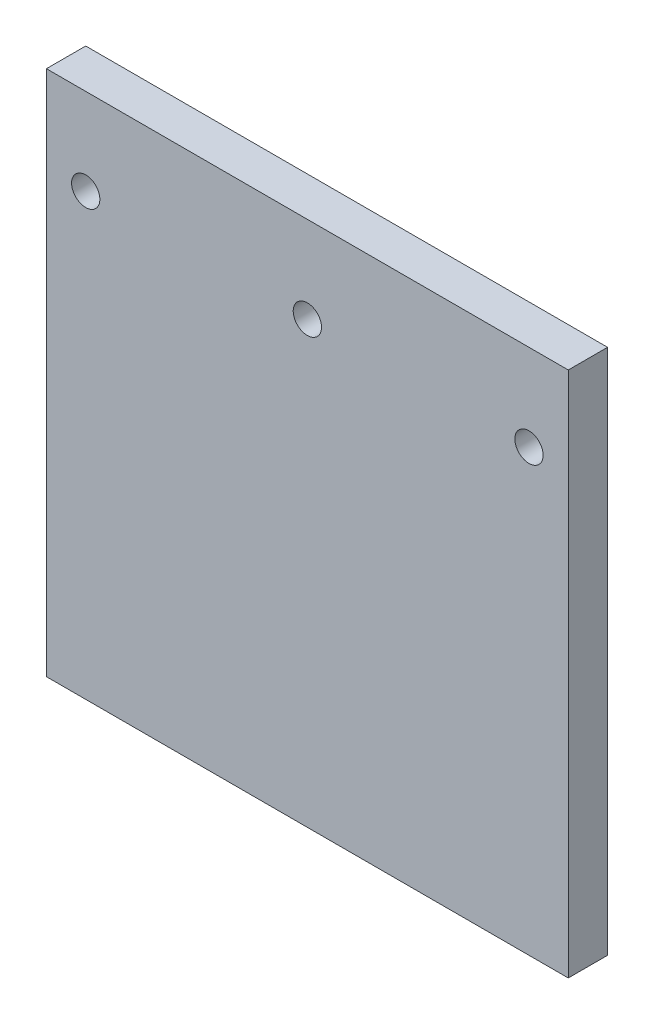
ISO-10303-21;
HEADER;
FILE_DESCRIPTION(('STEP AP214'),'2;1');
FILE_NAME('part.step','',(''),(''),'','','');
FILE_SCHEMA(('AUTOMOTIVE_DESIGN { 1 0 10303 214 1 1 1 1 }'));
ENDSEC;
DATA;
#1=APPLICATION_CONTEXT('core data for automotive mechanical design processes');
#2=APPLICATION_PROTOCOL_DEFINITION('international standard','automotive_design',2000,#1);
#3=PRODUCT_CONTEXT('',#1,'mechanical');
#4=PRODUCT('Part','Part','',(#3));
#5=PRODUCT_RELATED_PRODUCT_CATEGORY('part','',(#4));
#6=PRODUCT_DEFINITION_FORMATION('','',#4);
#7=PRODUCT_DEFINITION_CONTEXT('part definition',#1,'design');
#8=PRODUCT_DEFINITION('design','',#6,#7);
#9=PRODUCT_DEFINITION_SHAPE('','',#8);
#10=(LENGTH_UNIT() NAMED_UNIT(*) SI_UNIT(.MILLI.,.METRE.));
#11=(NAMED_UNIT(*) PLANE_ANGLE_UNIT() SI_UNIT($,.RADIAN.));
#12=(NAMED_UNIT(*) SI_UNIT($,.STERADIAN.) SOLID_ANGLE_UNIT());
#13=UNCERTAINTY_MEASURE_WITH_UNIT(LENGTH_MEASURE(1.E-05),#10,'distance_accuracy_value','');
#14=(GEOMETRIC_REPRESENTATION_CONTEXT(3) GLOBAL_UNCERTAINTY_ASSIGNED_CONTEXT((#13)) GLOBAL_UNIT_ASSIGNED_CONTEXT((#10,
#11,#12)) REPRESENTATION_CONTEXT('',''));
#15=CARTESIAN_POINT('',(0.,0.,0.));
#16=DIRECTION('',(0.,0.,1.));
#17=DIRECTION('',(1.,0.,0.));
#18=AXIS2_PLACEMENT_3D('',#15,#16,#17);
#19=CARTESIAN_POINT('',(0.,22.,0.));
#20=DIRECTION('',(0.,1.,0.));
#21=DIRECTION('',(0.,0.,1.));
#22=AXIS2_PLACEMENT_3D('',#19,#20,#21);
#23=PLANE('',#22);
#24=DIRECTION('',(0.,0.,1.));
#25=VECTOR('',#24,1.);
#26=CARTESIAN_POINT('',(58.2,22.,-114.));
#27=LINE('',#26,#25);
#28=CARTESIAN_POINT('',(58.2,22.,-27.));
#29=VERTEX_POINT('',#28);
#30=CARTESIAN_POINT('',(58.2,22.,-22.));
#31=VERTEX_POINT('',#30);
#32=EDGE_CURVE('E54',#29,#31,#27,.T.);
#33=ORIENTED_EDGE('',*,*,#32,.F.);
#34=DIRECTION('',(1.,0.,0.));
#35=VECTOR('',#34,1.);
#36=CARTESIAN_POINT('',(58.2,22.,-27.));
#37=LINE('',#36,#35);
#38=CARTESIAN_POINT('',(-8.2,22.,-27.));
#39=VERTEX_POINT('',#38);
#40=EDGE_CURVE('E101',#39,#29,#37,.T.);
#41=ORIENTED_EDGE('',*,*,#40,.F.);
#42=DIRECTION('',(0.,0.,1.));
#43=VECTOR('',#42,1.);
#44=CARTESIAN_POINT('',(-8.2,22.,-114.));
#45=LINE('',#44,#43);
#46=CARTESIAN_POINT('',(-8.2,22.,-22.));
#47=VERTEX_POINT('',#46);
#48=EDGE_CURVE('E117',#39,#47,#45,.T.);
#49=ORIENTED_EDGE('',*,*,#48,.T.);
#50=DIRECTION('',(-1.,0.,0.));
#51=VECTOR('',#50,1.);
#52=CARTESIAN_POINT('',(58.2,22.,-22.));
#53=LINE('',#52,#51);
#54=EDGE_CURVE('E11',#31,#47,#53,.T.);
#55=ORIENTED_EDGE('',*,*,#54,.F.);
#56=EDGE_LOOP('',(#33,#41,#49,#55));
#57=FACE_BOUND('',#56,.T.);
#58=ADVANCED_FACE('F39',(#57),#23,.T.);
#59=CARTESIAN_POINT('',(-8.2,-18.,-22.));
#60=DIRECTION('',(0.,0.,-1.));
#61=DIRECTION('',(-1.,0.,0.));
#62=AXIS2_PLACEMENT_3D('',#59,#60,#61);
#63=PLANE('',#62);
#64=CARTESIAN_POINT('',(53.2,11.,-22.));
#65=DIRECTION('',(0.,0.,-1.));
#66=DIRECTION('',(-1.,0.,0.));
#67=AXIS2_PLACEMENT_3D('',#64,#65,#66);
#68=CIRCLE('',#67,1.8);
#69=CARTESIAN_POINT('',(51.4,11.,-22.));
#70=VERTEX_POINT('',#69);
#71=EDGE_CURVE('E123',#70,#70,#68,.F.);
#72=ORIENTED_EDGE('',*,*,#71,.F.);
#73=EDGE_LOOP('',(#72));
#74=FACE_BOUND('',#73,.T.);
#75=DIRECTION('',(0.,1.,0.));
#76=VECTOR('',#75,1.);
#77=CARTESIAN_POINT('',(-8.2,22.,-22.));
#78=LINE('',#77,#76);
#79=CARTESIAN_POINT('',(-8.2,-45.,-22.));
#80=VERTEX_POINT('',#79);
#81=EDGE_CURVE('E115',#80,#47,#78,.T.);
#82=ORIENTED_EDGE('',*,*,#81,.F.);
#83=DIRECTION('',(-1.,0.,0.));
#84=VECTOR('',#83,1.);
#85=CARTESIAN_POINT('',(-8.2,-45.,-22.));
#86=LINE('',#85,#84);
#87=CARTESIAN_POINT('',(58.2,-45.,-22.));
#88=VERTEX_POINT('',#87);
#89=EDGE_CURVE('E85',#88,#80,#86,.T.);
#90=ORIENTED_EDGE('',*,*,#89,.F.);
#91=DIRECTION('',(0.,-1.,0.));
#92=VECTOR('',#91,1.);
#93=CARTESIAN_POINT('',(58.2,22.,-22.));
#94=LINE('',#93,#92);
#95=EDGE_CURVE('E81',#31,#88,#94,.T.);
#96=ORIENTED_EDGE('',*,*,#95,.F.);
#97=ORIENTED_EDGE('',*,*,#54,.T.);
#98=EDGE_LOOP('',(#82,#90,#96,#97));
#99=FACE_BOUND('',#98,.T.);
#100=CARTESIAN_POINT('',(-3.2,11.,-22.));
#101=DIRECTION('',(0.,0.,-1.));
#102=DIRECTION('',(-1.,0.,0.));
#103=AXIS2_PLACEMENT_3D('',#100,#101,#102);
#104=CIRCLE('',#103,1.8);
#105=CARTESIAN_POINT('',(-5.,11.,-22.));
#106=VERTEX_POINT('',#105);
#107=EDGE_CURVE('E47',#106,#106,#104,.F.);
#108=ORIENTED_EDGE('',*,*,#107,.F.);
#109=EDGE_LOOP('',(#108));
#110=FACE_BOUND('',#109,.T.);
#111=CARTESIAN_POINT('',(25.,11.,-22.));
#112=DIRECTION('',(0.,0.,-1.));
#113=DIRECTION('',(-1.,0.,0.));
#114=AXIS2_PLACEMENT_3D('',#111,#112,#113);
#115=CIRCLE('',#114,1.8);
#116=CARTESIAN_POINT('',(23.2,11.,-22.));
#117=VERTEX_POINT('',#116);
#118=EDGE_CURVE('E120',#117,#117,#115,.F.);
#119=ORIENTED_EDGE('',*,*,#118,.F.);
#120=EDGE_LOOP('',(#119));
#121=FACE_BOUND('',#120,.T.);
#122=ADVANCED_FACE('F41',(#74,#99,#110,#121),#63,.F.);
#123=CARTESIAN_POINT('',(-3.2,11.,74.));
#124=DIRECTION('',(0.,0.,-1.));
#125=DIRECTION('',(-1.,0.,0.));
#126=AXIS2_PLACEMENT_3D('',#123,#124,#125);
#127=CYLINDRICAL_SURFACE('',#126,1.8);
#128=ORIENTED_EDGE('',*,*,#107,.T.);
#129=EDGE_LOOP('',(#128));
#130=FACE_BOUND('',#129,.T.);
#131=CARTESIAN_POINT('',(-3.2,11.,-27.));
#132=DIRECTION('',(0.,0.,-1.));
#133=DIRECTION('',(-1.,0.,0.));
#134=AXIS2_PLACEMENT_3D('',#131,#132,#133);
#135=CIRCLE('',#134,1.8);
#136=CARTESIAN_POINT('',(-5.,11.,-27.));
#137=VERTEX_POINT('',#136);
#138=EDGE_CURVE('E145',#137,#137,#135,.T.);
#139=ORIENTED_EDGE('',*,*,#138,.T.);
#140=EDGE_LOOP('',(#139));
#141=FACE_BOUND('',#140,.T.);
#142=ADVANCED_FACE('F128',(#130,#141),#127,.F.);
#143=CARTESIAN_POINT('',(53.2,11.,74.));
#144=DIRECTION('',(0.,0.,-1.));
#145=DIRECTION('',(-1.,0.,0.));
#146=AXIS2_PLACEMENT_3D('',#143,#144,#145);
#147=CYLINDRICAL_SURFACE('',#146,1.8);
#148=ORIENTED_EDGE('',*,*,#71,.T.);
#149=EDGE_LOOP('',(#148));
#150=FACE_BOUND('',#149,.T.);
#151=CARTESIAN_POINT('',(53.2,11.,-27.));
#152=DIRECTION('',(0.,0.,-1.));
#153=DIRECTION('',(-1.,0.,0.));
#154=AXIS2_PLACEMENT_3D('',#151,#152,#153);
#155=CIRCLE('',#154,1.8);
#156=CARTESIAN_POINT('',(51.4,11.,-27.));
#157=VERTEX_POINT('',#156);
#158=EDGE_CURVE('E102',#157,#157,#155,.T.);
#159=ORIENTED_EDGE('',*,*,#158,.T.);
#160=EDGE_LOOP('',(#159));
#161=FACE_BOUND('',#160,.T.);
#162=ADVANCED_FACE('F140',(#150,#161),#147,.F.);
#163=CARTESIAN_POINT('',(25.,11.,74.));
#164=DIRECTION('',(0.,0.,-1.));
#165=DIRECTION('',(-1.,0.,0.));
#166=AXIS2_PLACEMENT_3D('',#163,#164,#165);
#167=CYLINDRICAL_SURFACE('',#166,1.8);
#168=ORIENTED_EDGE('',*,*,#118,.T.);
#169=EDGE_LOOP('',(#168));
#170=FACE_BOUND('',#169,.T.);
#171=CARTESIAN_POINT('',(25.,11.,-27.));
#172=DIRECTION('',(0.,0.,-1.));
#173=DIRECTION('',(-1.,0.,0.));
#174=AXIS2_PLACEMENT_3D('',#171,#172,#173);
#175=CIRCLE('',#174,1.8);
#176=CARTESIAN_POINT('',(23.2,11.,-27.));
#177=VERTEX_POINT('',#176);
#178=EDGE_CURVE('E105',#177,#177,#175,.T.);
#179=ORIENTED_EDGE('',*,*,#178,.T.);
#180=EDGE_LOOP('',(#179));
#181=FACE_BOUND('',#180,.T.);
#182=ADVANCED_FACE('F136',(#170,#181),#167,.F.);
#183=CARTESIAN_POINT('',(-8.2,22.,-114.));
#184=DIRECTION('',(1.,0.,0.));
#185=DIRECTION('',(0.,1.,0.));
#186=AXIS2_PLACEMENT_3D('',#183,#184,#185);
#187=PLANE('',#186);
#188=ORIENTED_EDGE('',*,*,#48,.F.);
#189=DIRECTION('',(0.,1.,0.));
#190=VECTOR('',#189,1.);
#191=CARTESIAN_POINT('',(-8.2,22.,-27.));
#192=LINE('',#191,#190);
#193=CARTESIAN_POINT('',(-8.2,-45.,-27.));
#194=VERTEX_POINT('',#193);
#195=EDGE_CURVE('E95',#194,#39,#192,.T.);
#196=ORIENTED_EDGE('',*,*,#195,.F.);
#197=DIRECTION('',(0.,0.,-1.));
#198=VECTOR('',#197,1.);
#199=CARTESIAN_POINT('',(-8.2,-45.,-22.));
#200=LINE('',#199,#198);
#201=EDGE_CURVE('E86',#80,#194,#200,.T.);
#202=ORIENTED_EDGE('',*,*,#201,.F.);
#203=ORIENTED_EDGE('',*,*,#81,.T.);
#204=EDGE_LOOP('',(#188,#196,#202,#203));
#205=FACE_BOUND('',#204,.T.);
#206=ADVANCED_FACE('F139',(#205),#187,.F.);
#207=CARTESIAN_POINT('',(58.2,22.,-114.));
#208=DIRECTION('',(-1.,0.,0.));
#209=DIRECTION('',(0.,0.,1.));
#210=AXIS2_PLACEMENT_3D('',#207,#208,#209);
#211=PLANE('',#210);
#212=ORIENTED_EDGE('',*,*,#32,.T.);
#213=ORIENTED_EDGE('',*,*,#95,.T.);
#214=DIRECTION('',(0.,0.,1.));
#215=VECTOR('',#214,1.);
#216=CARTESIAN_POINT('',(58.2,-45.,-22.));
#217=LINE('',#216,#215);
#218=CARTESIAN_POINT('',(58.2,-45.,-27.));
#219=VERTEX_POINT('',#218);
#220=EDGE_CURVE('E76',#219,#88,#217,.T.);
#221=ORIENTED_EDGE('',*,*,#220,.F.);
#222=DIRECTION('',(0.,-1.,0.));
#223=VECTOR('',#222,1.);
#224=CARTESIAN_POINT('',(58.2,22.,-27.));
#225=LINE('',#224,#223);
#226=EDGE_CURVE('E80',#29,#219,#225,.T.);
#227=ORIENTED_EDGE('',*,*,#226,.F.);
#228=EDGE_LOOP('',(#212,#213,#221,#227));
#229=FACE_BOUND('',#228,.T.);
#230=ADVANCED_FACE('F78',(#229),#211,.F.);
#231=CARTESIAN_POINT('',(0.,-45.,0.));
#232=DIRECTION('',(0.,-1.,0.));
#233=DIRECTION('',(0.,0.,-1.));
#234=AXIS2_PLACEMENT_3D('',#231,#232,#233);
#235=PLANE('',#234);
#236=ORIENTED_EDGE('',*,*,#201,.T.);
#237=DIRECTION('',(-1.,0.,0.));
#238=VECTOR('',#237,1.);
#239=CARTESIAN_POINT('',(58.2,-45.,-27.));
#240=LINE('',#239,#238);
#241=EDGE_CURVE('E89',#219,#194,#240,.T.);
#242=ORIENTED_EDGE('',*,*,#241,.F.);
#243=ORIENTED_EDGE('',*,*,#220,.T.);
#244=ORIENTED_EDGE('',*,*,#89,.T.);
#245=EDGE_LOOP('',(#236,#242,#243,#244));
#246=FACE_BOUND('',#245,.T.);
#247=ADVANCED_FACE('F90',(#246),#235,.T.);
#248=CARTESIAN_POINT('',(0.,0.,-27.));
#249=DIRECTION('',(0.,0.,-1.));
#250=DIRECTION('',(-1.,0.,0.));
#251=AXIS2_PLACEMENT_3D('',#248,#249,#250);
#252=PLANE('',#251);
#253=ORIENTED_EDGE('',*,*,#178,.F.);
#254=EDGE_LOOP('',(#253));
#255=FACE_BOUND('',#254,.T.);
#256=ORIENTED_EDGE('',*,*,#226,.T.);
#257=ORIENTED_EDGE('',*,*,#241,.T.);
#258=ORIENTED_EDGE('',*,*,#195,.T.);
#259=ORIENTED_EDGE('',*,*,#40,.T.);
#260=EDGE_LOOP('',(#256,#257,#258,#259));
#261=FACE_BOUND('',#260,.T.);
#262=ORIENTED_EDGE('',*,*,#158,.F.);
#263=EDGE_LOOP('',(#262));
#264=FACE_BOUND('',#263,.T.);
#265=ORIENTED_EDGE('',*,*,#138,.F.);
#266=EDGE_LOOP('',(#265));
#267=FACE_BOUND('',#266,.T.);
#268=ADVANCED_FACE('F98',(#255,#261,#264,#267),#252,.T.);
#269=CLOSED_SHELL('',(#58,#122,#142,#162,#182,#206,#230,#247,#268));
#270=MANIFOLD_SOLID_BREP('B2',#269);
#271=ADVANCED_BREP_SHAPE_REPRESENTATION('',(#18,#270),#14);
#272=SHAPE_DEFINITION_REPRESENTATION(#9,#271);
ENDSEC;
END-ISO-10303-21;
